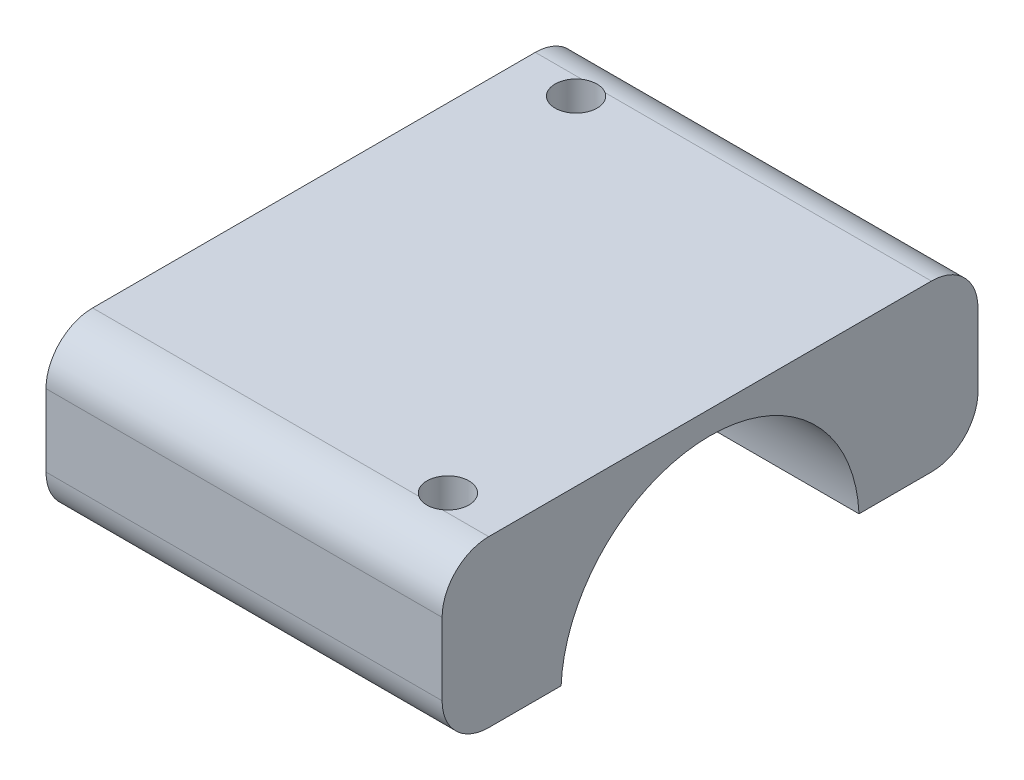
ISO-10303-21;
HEADER;
FILE_DESCRIPTION(('STEP AP214'),'2;1');
FILE_NAME('part.step','',(''),(''),'','','');
FILE_SCHEMA(('AUTOMOTIVE_DESIGN { 1 0 10303 214 1 1 1 1 }'));
ENDSEC;
DATA;
#1=APPLICATION_CONTEXT('core data for automotive mechanical design processes');
#2=APPLICATION_PROTOCOL_DEFINITION('international standard','automotive_design',2000,#1);
#3=PRODUCT_CONTEXT('',#1,'mechanical');
#4=PRODUCT('Part','Part','',(#3));
#5=PRODUCT_RELATED_PRODUCT_CATEGORY('part','',(#4));
#6=PRODUCT_DEFINITION_FORMATION('','',#4);
#7=PRODUCT_DEFINITION_CONTEXT('part definition',#1,'design');
#8=PRODUCT_DEFINITION('design','',#6,#7);
#9=PRODUCT_DEFINITION_SHAPE('','',#8);
#10=(LENGTH_UNIT() NAMED_UNIT(*) SI_UNIT(.MILLI.,.METRE.));
#11=(NAMED_UNIT(*) PLANE_ANGLE_UNIT() SI_UNIT($,.RADIAN.));
#12=(NAMED_UNIT(*) SI_UNIT($,.STERADIAN.) SOLID_ANGLE_UNIT());
#13=UNCERTAINTY_MEASURE_WITH_UNIT(LENGTH_MEASURE(1.E-05),#10,'distance_accuracy_value','');
#14=(GEOMETRIC_REPRESENTATION_CONTEXT(3) GLOBAL_UNCERTAINTY_ASSIGNED_CONTEXT((#13)) GLOBAL_UNIT_ASSIGNED_CONTEXT((#10,
#11,#12)) REPRESENTATION_CONTEXT('',''));
#15=CARTESIAN_POINT('',(0.,0.,0.));
#16=DIRECTION('',(0.,0.,1.));
#17=DIRECTION('',(1.,0.,0.));
#18=AXIS2_PLACEMENT_3D('',#15,#16,#17);
#19=CARTESIAN_POINT('',(17.,4.6,19.));
#20=DIRECTION('',(-1.,0.,0.));
#21=DIRECTION('',(0.,0.,1.));
#22=AXIS2_PLACEMENT_3D('',#19,#20,#21);
#23=CYLINDRICAL_SURFACE('',#22,4.);
#24=CARTESIAN_POINT('',(12.9949874371066,0.6,19.));
#25=CARTESIAN_POINT('',(12.9528080505859,0.600002290201008,19.0279782687762));
#26=CARTESIAN_POINT('',(12.9094699375662,0.600293109258532,19.054162436945));
#27=CARTESIAN_POINT('',(12.8207506643026,0.601246630542694,19.1027880961604));
#28=CARTESIAN_POINT('',(12.775369663094,0.601909303866988,19.1252298779078));
#29=CARTESIAN_POINT('',(12.6367080465194,0.60414515604213,19.1866521635867));
#30=CARTESIAN_POINT('',(12.5407755741953,0.605967454515857,19.2198177956695));
#31=CARTESIAN_POINT('',(12.3447108790185,0.609016111648687,19.2695824039112));
#32=CARTESIAN_POINT('',(12.2445771529861,0.610242254997947,19.2861753969049));
#33=CARTESIAN_POINT('',(12.0429252939834,0.611432977587128,19.3023260095373));
#34=CARTESIAN_POINT('',(11.9414072407699,0.611397629202322,19.3018846064864));
#35=CARTESIAN_POINT('',(11.7400149572337,0.6100843959537,19.2839916011113));
#36=CARTESIAN_POINT('',(11.6401391343925,0.608807797075412,19.266557603754));
#37=CARTESIAN_POINT('',(11.444762981889,0.605710678825216,19.2151942389305));
#38=CARTESIAN_POINT('',(11.3492591599958,0.603890602630139,19.181278297527));
#39=CARTESIAN_POINT('',(11.2134628948282,0.601745422922836,19.1197807652606));
#40=CARTESIAN_POINT('',(11.1703945654969,0.601136078493984,19.0981480345368));
#41=CARTESIAN_POINT('',(11.0862091669758,0.600264553601652,19.0515455180329));
#42=CARTESIAN_POINT('',(11.0450884560688,0.600001698383489,19.0265823227808));
#43=CARTESIAN_POINT('',(11.0050125628934,0.6,19.));
#44=B_SPLINE_CURVE_WITH_KNOTS('',3,(#24,#25,#26,#27,#28,#29,#30,#31,#32,#33,#34,#35,#36,#37,#38,
#39,#40,#41,#42,#43),.UNSPECIFIED.,.F.,.F.,(4,2,2,2,2,2,2,2,2,4),(0.,0.151748564164442,
0.30348533531734,0.606485618853393,0.90959525408197,1.21268749909945,1.51546606256915,
1.81799839737315,1.96246492195647,2.10664969408635),.UNSPECIFIED.);
#45=CARTESIAN_POINT('',(12.9949874371066,0.6,19.));
#46=VERTEX_POINT('',#45);
#47=CARTESIAN_POINT('',(11.0050125628934,0.6,19.));
#48=VERTEX_POINT('',#47);
#49=EDGE_CURVE('E136',#46,#48,#44,.T.);
#50=ORIENTED_EDGE('',*,*,#49,.F.);
#51=DIRECTION('',(-1.,0.,0.));
#52=VECTOR('',#51,1.);
#53=CARTESIAN_POINT('',(17.,0.6,19.));
#54=LINE('',#53,#52);
#55=CARTESIAN_POINT('',(17.,0.6,19.));
#56=VERTEX_POINT('',#55);
#57=EDGE_CURVE('E150',#56,#46,#54,.T.);
#58=ORIENTED_EDGE('',*,*,#57,.F.);
#59=CARTESIAN_POINT('',(17.,4.6,19.));
#60=DIRECTION('',(1.,0.,0.));
#61=DIRECTION('',(0.,0.,-1.));
#62=AXIS2_PLACEMENT_3D('',#59,#60,#61);
#63=CIRCLE('',#62,4.);
#64=CARTESIAN_POINT('',(17.,4.6,23.));
#65=VERTEX_POINT('',#64);
#66=EDGE_CURVE('E333',#65,#56,#63,.T.);
#67=ORIENTED_EDGE('',*,*,#66,.F.);
#68=DIRECTION('',(-1.,0.,0.));
#69=VECTOR('',#68,1.);
#70=CARTESIAN_POINT('',(17.,4.6,23.));
#71=LINE('',#70,#69);
#72=CARTESIAN_POINT('',(-17.,4.6,23.));
#73=VERTEX_POINT('',#72);
#74=EDGE_CURVE('E313',#65,#73,#71,.T.);
#75=ORIENTED_EDGE('',*,*,#74,.T.);
#76=CARTESIAN_POINT('',(-17.,4.6,19.));
#77=DIRECTION('',(1.,0.,0.));
#78=DIRECTION('',(0.,0.,-1.));
#79=AXIS2_PLACEMENT_3D('',#76,#77,#78);
#80=CIRCLE('',#79,4.);
#81=CARTESIAN_POINT('',(-17.,0.6,19.));
#82=VERTEX_POINT('',#81);
#83=EDGE_CURVE('E155',#73,#82,#80,.T.);
#84=ORIENTED_EDGE('',*,*,#83,.T.);
#85=EDGE_CURVE('E148',#48,#82,#54,.T.);
#86=ORIENTED_EDGE('',*,*,#85,.F.);
#87=EDGE_LOOP('',(#50,#58,#67,#75,#84,#86));
#88=FACE_BOUND('',#87,.T.);
#89=ADVANCED_FACE('F39',(#88),#23,.T.);
#90=CARTESIAN_POINT('',(17.,4.6,-19.));
#91=DIRECTION('',(-1.,0.,0.));
#92=DIRECTION('',(0.,0.,1.));
#93=AXIS2_PLACEMENT_3D('',#90,#91,#92);
#94=CYLINDRICAL_SURFACE('',#93,4.);
#95=CARTESIAN_POINT('',(-12.9949874371066,0.6,-19.));
#96=CARTESIAN_POINT('',(-12.9528080505859,0.600002290201008,-19.0279782687762));
#97=CARTESIAN_POINT('',(-12.9094699375662,0.600293109258532,-19.054162436945));
#98=CARTESIAN_POINT('',(-12.8207506643026,0.601246630542694,-19.1027880961604));
#99=CARTESIAN_POINT('',(-12.775369663094,0.601909303866988,-19.1252298779078));
#100=CARTESIAN_POINT('',(-12.6367080465194,0.60414515604213,-19.1866521635867));
#101=CARTESIAN_POINT('',(-12.5407755741953,0.605967454515857,-19.2198177956695));
#102=CARTESIAN_POINT('',(-12.3447108790185,0.609016111648687,-19.2695824039112));
#103=CARTESIAN_POINT('',(-12.2445771529861,0.610242254997947,-19.2861753969049));
#104=CARTESIAN_POINT('',(-12.0429252939834,0.611432977587128,-19.3023260095373));
#105=CARTESIAN_POINT('',(-11.9414072407699,0.611397629202322,-19.3018846064864));
#106=CARTESIAN_POINT('',(-11.7400149572337,0.6100843959537,-19.2839916011113));
#107=CARTESIAN_POINT('',(-11.6401391343925,0.608807797075412,-19.266557603754));
#108=CARTESIAN_POINT('',(-11.444762981889,0.605710678825216,-19.2151942389305));
#109=CARTESIAN_POINT('',(-11.3492591599958,0.603890602630139,-19.181278297527));
#110=CARTESIAN_POINT('',(-11.2134628948282,0.601745422922836,-19.1197807652606));
#111=CARTESIAN_POINT('',(-11.1703945654969,0.601136078493984,-19.0981480345368));
#112=CARTESIAN_POINT('',(-11.0862091669758,0.600264553601652,-19.0515455180329));
#113=CARTESIAN_POINT('',(-11.0450884560688,0.600001698383489,-19.0265823227808));
#114=CARTESIAN_POINT('',(-11.0050125628934,0.6,-19.));
#115=B_SPLINE_CURVE_WITH_KNOTS('',3,(#95,#96,#97,#98,#99,#100,#101,#102,#103,#104,#105,#106,
#107,#108,#109,#110,#111,#112,#113,#114),.UNSPECIFIED.,.F.,.F.,(4,2,2,2,2,2,2,2,2,4),(0.,
0.151748564164442,0.30348533531734,0.606485618853393,0.90959525408197,1.21268749909945,
1.51546606256915,1.81799839737315,1.96246492195647,2.10664969408635),.UNSPECIFIED.);
#116=CARTESIAN_POINT('',(-12.9949874371066,0.6,-19.));
#117=VERTEX_POINT('',#116);
#118=CARTESIAN_POINT('',(-11.0050125628934,0.6,-19.));
#119=VERTEX_POINT('',#118);
#120=EDGE_CURVE('E194',#117,#119,#115,.T.);
#121=ORIENTED_EDGE('',*,*,#120,.F.);
#122=DIRECTION('',(-1.,0.,0.));
#123=VECTOR('',#122,1.);
#124=CARTESIAN_POINT('',(17.,0.6,-19.));
#125=LINE('',#124,#123);
#126=CARTESIAN_POINT('',(-17.,0.6,-19.));
#127=VERTEX_POINT('',#126);
#128=EDGE_CURVE('E159',#117,#127,#125,.T.);
#129=ORIENTED_EDGE('',*,*,#128,.T.);
#130=CARTESIAN_POINT('',(-17.,4.6,-19.));
#131=DIRECTION('',(1.,0.,0.));
#132=DIRECTION('',(0.,0.,-1.));
#133=AXIS2_PLACEMENT_3D('',#130,#131,#132);
#134=CIRCLE('',#133,4.);
#135=CARTESIAN_POINT('',(-17.,4.6,-23.));
#136=VERTEX_POINT('',#135);
#137=EDGE_CURVE('E319',#127,#136,#134,.T.);
#138=ORIENTED_EDGE('',*,*,#137,.T.);
#139=DIRECTION('',(-1.,0.,0.));
#140=VECTOR('',#139,1.);
#141=CARTESIAN_POINT('',(17.,4.6,-23.));
#142=LINE('',#141,#140);
#143=CARTESIAN_POINT('',(17.,4.6,-23.));
#144=VERTEX_POINT('',#143);
#145=EDGE_CURVE('E293',#144,#136,#142,.T.);
#146=ORIENTED_EDGE('',*,*,#145,.F.);
#147=CARTESIAN_POINT('',(17.,4.6,-19.));
#148=DIRECTION('',(1.,0.,0.));
#149=DIRECTION('',(0.,0.,-1.));
#150=AXIS2_PLACEMENT_3D('',#147,#148,#149);
#151=CIRCLE('',#150,4.);
#152=CARTESIAN_POINT('',(17.,0.6,-19.));
#153=VERTEX_POINT('',#152);
#154=EDGE_CURVE('E291',#153,#144,#151,.T.);
#155=ORIENTED_EDGE('',*,*,#154,.F.);
#156=EDGE_CURVE('E156',#153,#119,#125,.T.);
#157=ORIENTED_EDGE('',*,*,#156,.T.);
#158=EDGE_LOOP('',(#121,#129,#138,#146,#155,#157));
#159=FACE_BOUND('',#158,.T.);
#160=ADVANCED_FACE('F205',(#159),#94,.T.);
#161=CARTESIAN_POINT('',(17.,10.8,-19.));
#162=DIRECTION('',(-1.,0.,0.));
#163=DIRECTION('',(0.,0.,1.));
#164=AXIS2_PLACEMENT_3D('',#161,#162,#163);
#165=CYLINDRICAL_SURFACE('',#164,4.);
#166=CARTESIAN_POINT('',(-11.0050125628934,14.8,-19.));
#167=CARTESIAN_POINT('',(-11.0471919494141,14.799997709799,-19.0279782687762));
#168=CARTESIAN_POINT('',(-11.0905300624338,14.7997068907415,-19.054162436945));
#169=CARTESIAN_POINT('',(-11.1792493356974,14.7987533694573,-19.1027880961604));
#170=CARTESIAN_POINT('',(-11.224630336906,14.798090696133,-19.1252298779078));
#171=CARTESIAN_POINT('',(-11.3632919534806,14.7958548439579,-19.1866521635867));
#172=CARTESIAN_POINT('',(-11.4592244258047,14.7940325454841,-19.2198177956695));
#173=CARTESIAN_POINT('',(-11.6552891209815,14.7909838883513,-19.2695824039112));
#174=CARTESIAN_POINT('',(-11.7554228470139,14.7897577450021,-19.2861753969049));
#175=CARTESIAN_POINT('',(-11.9570747060166,14.7885670224129,-19.3023260095373));
#176=CARTESIAN_POINT('',(-12.0585927592301,14.7886023707977,-19.3018846064864));
#177=CARTESIAN_POINT('',(-12.2599850427663,14.7899156040463,-19.2839916011113));
#178=CARTESIAN_POINT('',(-12.3598608656075,14.7911922029246,-19.266557603754));
#179=CARTESIAN_POINT('',(-12.555237018111,14.7942893211748,-19.2151942389305));
#180=CARTESIAN_POINT('',(-12.6507408400042,14.7961093973699,-19.181278297527));
#181=CARTESIAN_POINT('',(-12.7865371051718,14.7982545770772,-19.1197807652606));
#182=CARTESIAN_POINT('',(-12.8296054345031,14.798863921506,-19.0981480345368));
#183=CARTESIAN_POINT('',(-12.9137908330242,14.7997354463983,-19.0515455180329));
#184=CARTESIAN_POINT('',(-12.9549115439312,14.7999983016165,-19.0265823227808));
#185=CARTESIAN_POINT('',(-12.9949874371066,14.8,-19.));
#186=B_SPLINE_CURVE_WITH_KNOTS('',3,(#166,#167,#168,#169,#170,#171,#172,#173,#174,#175,#176,
#177,#178,#179,#180,#181,#182,#183,#184,#185),.UNSPECIFIED.,.F.,.F.,(4,2,2,2,2,2,2,2,2,4),(0.,
0.151748564164442,0.30348533531734,0.606485618853393,0.909595254081972,1.21268749909945,
1.51546606256915,1.81799839737315,1.96246492195647,2.10664969408635),.UNSPECIFIED.);
#187=CARTESIAN_POINT('',(-11.0050125628934,14.8,-19.));
#188=VERTEX_POINT('',#187);
#189=CARTESIAN_POINT('',(-12.9949874371066,14.8,-19.));
#190=VERTEX_POINT('',#189);
#191=EDGE_CURVE('E142',#188,#190,#186,.T.);
#192=ORIENTED_EDGE('',*,*,#191,.F.);
#193=DIRECTION('',(-1.,0.,0.));
#194=VECTOR('',#193,1.);
#195=CARTESIAN_POINT('',(17.,14.8,-19.));
#196=LINE('',#195,#194);
#197=CARTESIAN_POINT('',(17.,14.8,-19.));
#198=VERTEX_POINT('',#197);
#199=EDGE_CURVE('E343',#198,#188,#196,.T.);
#200=ORIENTED_EDGE('',*,*,#199,.F.);
#201=CARTESIAN_POINT('',(17.,10.8,-19.));
#202=DIRECTION('',(1.,0.,0.));
#203=DIRECTION('',(0.,0.,-1.));
#204=AXIS2_PLACEMENT_3D('',#201,#202,#203);
#205=CIRCLE('',#204,4.);
#206=CARTESIAN_POINT('',(17.,10.8,-23.));
#207=VERTEX_POINT('',#206);
#208=EDGE_CURVE('E299',#207,#198,#205,.T.);
#209=ORIENTED_EDGE('',*,*,#208,.F.);
#210=DIRECTION('',(-1.,0.,0.));
#211=VECTOR('',#210,1.);
#212=CARTESIAN_POINT('',(17.,10.8,-23.));
#213=LINE('',#212,#211);
#214=CARTESIAN_POINT('',(-17.,10.8,-23.));
#215=VERTEX_POINT('',#214);
#216=EDGE_CURVE('E346',#207,#215,#213,.T.);
#217=ORIENTED_EDGE('',*,*,#216,.T.);
#218=CARTESIAN_POINT('',(-17.,10.8,-19.));
#219=DIRECTION('',(1.,0.,0.));
#220=DIRECTION('',(0.,0.,-1.));
#221=AXIS2_PLACEMENT_3D('',#218,#219,#220);
#222=CIRCLE('',#221,4.);
#223=CARTESIAN_POINT('',(-17.,14.8,-19.));
#224=VERTEX_POINT('',#223);
#225=EDGE_CURVE('E323',#215,#224,#222,.T.);
#226=ORIENTED_EDGE('',*,*,#225,.T.);
#227=EDGE_CURVE('E342',#190,#224,#196,.T.);
#228=ORIENTED_EDGE('',*,*,#227,.F.);
#229=EDGE_LOOP('',(#192,#200,#209,#217,#226,#228));
#230=FACE_BOUND('',#229,.T.);
#231=ADVANCED_FACE('F201',(#230),#165,.T.);
#232=CARTESIAN_POINT('',(17.,10.8,19.));
#233=DIRECTION('',(-1.,0.,0.));
#234=DIRECTION('',(0.,0.,1.));
#235=AXIS2_PLACEMENT_3D('',#232,#233,#234);
#236=CYLINDRICAL_SURFACE('',#235,4.);
#237=CARTESIAN_POINT('',(11.0050125628934,14.8,19.));
#238=CARTESIAN_POINT('',(11.0471919494141,14.799997709799,19.0279782687762));
#239=CARTESIAN_POINT('',(11.0905300624338,14.7997068907415,19.054162436945));
#240=CARTESIAN_POINT('',(11.1792493356974,14.7987533694573,19.1027880961604));
#241=CARTESIAN_POINT('',(11.224630336906,14.798090696133,19.1252298779078));
#242=CARTESIAN_POINT('',(11.3632919534806,14.7958548439579,19.1866521635867));
#243=CARTESIAN_POINT('',(11.4592244258047,14.7940325454841,19.2198177956695));
#244=CARTESIAN_POINT('',(11.6552891209815,14.7909838883513,19.2695824039112));
#245=CARTESIAN_POINT('',(11.7554228470139,14.7897577450021,19.2861753969049));
#246=CARTESIAN_POINT('',(11.9570747060166,14.7885670224129,19.3023260095373));
#247=CARTESIAN_POINT('',(12.0585927592301,14.7886023707977,19.3018846064864));
#248=CARTESIAN_POINT('',(12.2599850427663,14.7899156040463,19.2839916011113));
#249=CARTESIAN_POINT('',(12.3598608656075,14.7911922029246,19.266557603754));
#250=CARTESIAN_POINT('',(12.555237018111,14.7942893211748,19.2151942389305));
#251=CARTESIAN_POINT('',(12.6507408400042,14.7961093973699,19.181278297527));
#252=CARTESIAN_POINT('',(12.7865371051718,14.7982545770772,19.1197807652606));
#253=CARTESIAN_POINT('',(12.8296054345031,14.798863921506,19.0981480345368));
#254=CARTESIAN_POINT('',(12.9137908330242,14.7997354463983,19.0515455180329));
#255=CARTESIAN_POINT('',(12.9549115439312,14.7999983016165,19.0265823227808));
#256=CARTESIAN_POINT('',(12.9949874371066,14.8,19.));
#257=B_SPLINE_CURVE_WITH_KNOTS('',3,(#237,#238,#239,#240,#241,#242,#243,#244,#245,#246,#247,
#248,#249,#250,#251,#252,#253,#254,#255,#256),.UNSPECIFIED.,.F.,.F.,(4,2,2,2,2,2,2,2,2,4),(0.,
0.151748564164442,0.30348533531734,0.606485618853393,0.909595254081972,1.21268749909945,
1.51546606256915,1.81799839737315,1.96246492195647,2.10664969408635),.UNSPECIFIED.);
#258=CARTESIAN_POINT('',(11.0050125628934,14.8,19.));
#259=VERTEX_POINT('',#258);
#260=CARTESIAN_POINT('',(12.9949874371066,14.8,19.));
#261=VERTEX_POINT('',#260);
#262=EDGE_CURVE('E47',#259,#261,#257,.T.);
#263=ORIENTED_EDGE('',*,*,#262,.F.);
#264=DIRECTION('',(-1.,0.,0.));
#265=VECTOR('',#264,1.);
#266=CARTESIAN_POINT('',(17.,14.8,19.));
#267=LINE('',#266,#265);
#268=CARTESIAN_POINT('',(-17.,14.8,19.));
#269=VERTEX_POINT('',#268);
#270=EDGE_CURVE('E338',#259,#269,#267,.T.);
#271=ORIENTED_EDGE('',*,*,#270,.T.);
#272=CARTESIAN_POINT('',(-17.,10.8,19.));
#273=DIRECTION('',(1.,0.,0.));
#274=DIRECTION('',(0.,0.,-1.));
#275=AXIS2_PLACEMENT_3D('',#272,#273,#274);
#276=CIRCLE('',#275,4.);
#277=CARTESIAN_POINT('',(-17.,10.8,23.));
#278=VERTEX_POINT('',#277);
#279=EDGE_CURVE('E329',#269,#278,#276,.T.);
#280=ORIENTED_EDGE('',*,*,#279,.T.);
#281=DIRECTION('',(-1.,0.,0.));
#282=VECTOR('',#281,1.);
#283=CARTESIAN_POINT('',(17.,10.8,23.));
#284=LINE('',#283,#282);
#285=CARTESIAN_POINT('',(17.,10.8,23.));
#286=VERTEX_POINT('',#285);
#287=EDGE_CURVE('E335',#286,#278,#284,.T.);
#288=ORIENTED_EDGE('',*,*,#287,.F.);
#289=CARTESIAN_POINT('',(17.,10.8,19.));
#290=DIRECTION('',(1.,0.,0.));
#291=DIRECTION('',(0.,0.,-1.));
#292=AXIS2_PLACEMENT_3D('',#289,#290,#291);
#293=CIRCLE('',#292,4.);
#294=CARTESIAN_POINT('',(17.,14.8,19.));
#295=VERTEX_POINT('',#294);
#296=EDGE_CURVE('E309',#295,#286,#293,.T.);
#297=ORIENTED_EDGE('',*,*,#296,.F.);
#298=EDGE_CURVE('E339',#295,#261,#267,.T.);
#299=ORIENTED_EDGE('',*,*,#298,.T.);
#300=EDGE_LOOP('',(#263,#271,#280,#288,#297,#299));
#301=FACE_BOUND('',#300,.T.);
#302=ADVANCED_FACE('F168',(#301),#236,.T.);
#303=CARTESIAN_POINT('',(17.,0.6,19.));
#304=DIRECTION('',(0.,1.,0.));
#305=DIRECTION('',(0.,0.,1.));
#306=AXIS2_PLACEMENT_3D('',#303,#304,#305);
#307=PLANE('',#306);
#308=CARTESIAN_POINT('',(12.,0.6,17.5));
#309=DIRECTION('',(0.,1.,0.));
#310=DIRECTION('',(0.,0.,1.));
#311=AXIS2_PLACEMENT_3D('',#308,#309,#310);
#312=CIRCLE('',#311,1.8);
#313=EDGE_CURVE('E53',#46,#48,#312,.T.);
#314=ORIENTED_EDGE('',*,*,#313,.T.);
#315=ORIENTED_EDGE('',*,*,#85,.T.);
#316=DIRECTION('',(0.,0.,-1.));
#317=VECTOR('',#316,1.);
#318=CARTESIAN_POINT('',(-17.,0.6,19.));
#319=LINE('',#318,#317);
#320=CARTESIAN_POINT('',(-17.,0.6,12.7859297667397));
#321=VERTEX_POINT('',#320);
#322=EDGE_CURVE('E317',#82,#321,#319,.T.);
#323=ORIENTED_EDGE('',*,*,#322,.T.);
#324=DIRECTION('',(1.,0.,0.));
#325=VECTOR('',#324,1.);
#326=CARTESIAN_POINT('',(-17.,0.6,12.7859297667397));
#327=LINE('',#326,#325);
#328=CARTESIAN_POINT('',(17.,0.6,12.7859297667397));
#329=VERTEX_POINT('',#328);
#330=EDGE_CURVE('E316',#321,#329,#327,.T.);
#331=ORIENTED_EDGE('',*,*,#330,.T.);
#332=DIRECTION('',(0.,0.,-1.));
#333=VECTOR('',#332,1.);
#334=CARTESIAN_POINT('',(17.,0.6,19.));
#335=LINE('',#334,#333);
#336=EDGE_CURVE('E297',#56,#329,#335,.T.);
#337=ORIENTED_EDGE('',*,*,#336,.F.);
#338=ORIENTED_EDGE('',*,*,#57,.T.);
#339=EDGE_LOOP('',(#314,#315,#323,#331,#337,#338));
#340=FACE_BOUND('',#339,.T.);
#341=ADVANCED_FACE('F146',(#340),#307,.F.);
#342=CARTESIAN_POINT('',(-12.,0.6,-17.5));
#343=DIRECTION('',(0.,1.,0.));
#344=DIRECTION('',(0.,0.,1.));
#345=AXIS2_PLACEMENT_3D('',#342,#343,#344);
#346=CIRCLE('',#345,1.8);
#347=EDGE_CURVE('E60',#117,#119,#346,.T.);
#348=ORIENTED_EDGE('',*,*,#347,.T.);
#349=ORIENTED_EDGE('',*,*,#156,.F.);
#350=CARTESIAN_POINT('',(17.,0.6,-12.7859297667397));
#351=VERTEX_POINT('',#350);
#352=EDGE_CURVE('E302',#351,#153,#335,.T.);
#353=ORIENTED_EDGE('',*,*,#352,.F.);
#354=DIRECTION('',(1.,0.,0.));
#355=VECTOR('',#354,1.);
#356=CARTESIAN_POINT('',(-17.,0.6,-12.7859297667397));
#357=LINE('',#356,#355);
#358=CARTESIAN_POINT('',(-17.,0.6,-12.7859297667397));
#359=VERTEX_POINT('',#358);
#360=EDGE_CURVE('E352',#351,#359,#357,.F.);
#361=ORIENTED_EDGE('',*,*,#360,.T.);
#362=EDGE_CURVE('E315',#359,#127,#319,.T.);
#363=ORIENTED_EDGE('',*,*,#362,.T.);
#364=ORIENTED_EDGE('',*,*,#128,.F.);
#365=EDGE_LOOP('',(#348,#349,#353,#361,#363,#364));
#366=FACE_BOUND('',#365,.T.);
#367=ADVANCED_FACE('F210',(#366),#307,.F.);
#368=CARTESIAN_POINT('',(17.,4.6,-23.));
#369=DIRECTION('',(0.,0.,1.));
#370=DIRECTION('',(1.,0.,0.));
#371=AXIS2_PLACEMENT_3D('',#368,#369,#370);
#372=PLANE('',#371);
#373=DIRECTION('',(0.,1.,0.));
#374=VECTOR('',#373,1.);
#375=CARTESIAN_POINT('',(-17.,4.6,-23.));
#376=LINE('',#375,#374);
#377=EDGE_CURVE('E321',#136,#215,#376,.T.);
#378=ORIENTED_EDGE('',*,*,#377,.T.);
#379=ORIENTED_EDGE('',*,*,#216,.F.);
#380=DIRECTION('',(0.,1.,0.));
#381=VECTOR('',#380,1.);
#382=CARTESIAN_POINT('',(17.,4.6,-23.));
#383=LINE('',#382,#381);
#384=EDGE_CURVE('E296',#144,#207,#383,.T.);
#385=ORIENTED_EDGE('',*,*,#384,.F.);
#386=ORIENTED_EDGE('',*,*,#145,.T.);
#387=EDGE_LOOP('',(#378,#379,#385,#386));
#388=FACE_BOUND('',#387,.T.);
#389=ADVANCED_FACE('F208',(#388),#372,.F.);
#390=CARTESIAN_POINT('',(17.,14.8,-19.));
#391=DIRECTION('',(0.,-1.,0.));
#392=DIRECTION('',(0.,0.,-1.));
#393=AXIS2_PLACEMENT_3D('',#390,#391,#392);
#394=PLANE('',#393);
#395=CARTESIAN_POINT('',(12.,14.8,17.5));
#396=DIRECTION('',(0.,-1.,0.));
#397=DIRECTION('',(0.,0.,-1.));
#398=AXIS2_PLACEMENT_3D('',#395,#396,#397);
#399=CIRCLE('',#398,1.8);
#400=EDGE_CURVE('E143',#261,#259,#399,.F.);
#401=ORIENTED_EDGE('',*,*,#400,.F.);
#402=ORIENTED_EDGE('',*,*,#298,.F.);
#403=DIRECTION('',(0.,0.,1.));
#404=VECTOR('',#403,1.);
#405=CARTESIAN_POINT('',(17.,14.8,-19.));
#406=LINE('',#405,#404);
#407=EDGE_CURVE('E307',#198,#295,#406,.T.);
#408=ORIENTED_EDGE('',*,*,#407,.F.);
#409=ORIENTED_EDGE('',*,*,#199,.T.);
#410=CARTESIAN_POINT('',(-12.,14.8,-17.5));
#411=DIRECTION('',(0.,-1.,0.));
#412=DIRECTION('',(0.,0.,-1.));
#413=AXIS2_PLACEMENT_3D('',#410,#411,#412);
#414=CIRCLE('',#413,1.8);
#415=EDGE_CURVE('E11',#190,#188,#414,.F.);
#416=ORIENTED_EDGE('',*,*,#415,.F.);
#417=ORIENTED_EDGE('',*,*,#227,.T.);
#418=DIRECTION('',(0.,0.,1.));
#419=VECTOR('',#418,1.);
#420=CARTESIAN_POINT('',(-17.,14.8,-19.));
#421=LINE('',#420,#419);
#422=EDGE_CURVE('E326',#224,#269,#421,.T.);
#423=ORIENTED_EDGE('',*,*,#422,.T.);
#424=ORIENTED_EDGE('',*,*,#270,.F.);
#425=EDGE_LOOP('',(#401,#402,#408,#409,#416,#417,#423,#424));
#426=FACE_BOUND('',#425,.T.);
#427=ADVANCED_FACE('F207',(#426),#394,.F.);
#428=CARTESIAN_POINT('',(17.,10.8,23.));
#429=DIRECTION('',(0.,0.,-1.));
#430=DIRECTION('',(-1.,0.,0.));
#431=AXIS2_PLACEMENT_3D('',#428,#429,#430);
#432=PLANE('',#431);
#433=DIRECTION('',(0.,-1.,0.));
#434=VECTOR('',#433,1.);
#435=CARTESIAN_POINT('',(-17.,10.8,23.));
#436=LINE('',#435,#434);
#437=EDGE_CURVE('E331',#278,#73,#436,.T.);
#438=ORIENTED_EDGE('',*,*,#437,.T.);
#439=ORIENTED_EDGE('',*,*,#74,.F.);
#440=DIRECTION('',(0.,-1.,0.));
#441=VECTOR('',#440,1.);
#442=CARTESIAN_POINT('',(17.,10.8,23.));
#443=LINE('',#442,#441);
#444=EDGE_CURVE('E311',#286,#65,#443,.T.);
#445=ORIENTED_EDGE('',*,*,#444,.F.);
#446=ORIENTED_EDGE('',*,*,#287,.T.);
#447=EDGE_LOOP('',(#438,#439,#445,#446));
#448=FACE_BOUND('',#447,.T.);
#449=ADVANCED_FACE('F376',(#448),#432,.F.);
#450=CARTESIAN_POINT('',(17.,4.6,19.));
#451=DIRECTION('',(1.,0.,0.));
#452=DIRECTION('',(0.,0.,-1.));
#453=AXIS2_PLACEMENT_3D('',#450,#451,#452);
#454=PLANE('',#453);
#455=CARTESIAN_POINT('',(17.,0.,0.));
#456=DIRECTION('',(1.,0.,0.));
#457=DIRECTION('',(0.,0.,-1.));
#458=AXIS2_PLACEMENT_3D('',#455,#456,#457);
#459=CIRCLE('',#458,12.8);
#460=EDGE_CURVE('E285',#351,#329,#459,.T.);
#461=ORIENTED_EDGE('',*,*,#460,.F.);
#462=ORIENTED_EDGE('',*,*,#352,.T.);
#463=ORIENTED_EDGE('',*,*,#154,.T.);
#464=ORIENTED_EDGE('',*,*,#384,.T.);
#465=ORIENTED_EDGE('',*,*,#208,.T.);
#466=ORIENTED_EDGE('',*,*,#407,.T.);
#467=ORIENTED_EDGE('',*,*,#296,.T.);
#468=ORIENTED_EDGE('',*,*,#444,.T.);
#469=ORIENTED_EDGE('',*,*,#66,.T.);
#470=ORIENTED_EDGE('',*,*,#336,.T.);
#471=EDGE_LOOP('',(#461,#462,#463,#464,#465,#466,#467,#468,#469,#470));
#472=FACE_BOUND('',#471,.T.);
#473=ADVANCED_FACE('F363',(#472),#454,.T.);
#474=CARTESIAN_POINT('',(-17.,4.6,19.));
#475=DIRECTION('',(1.,0.,0.));
#476=DIRECTION('',(0.,0.,-1.));
#477=AXIS2_PLACEMENT_3D('',#474,#475,#476);
#478=PLANE('',#477);
#479=ORIENTED_EDGE('',*,*,#362,.F.);
#480=CARTESIAN_POINT('',(-17.,0.,0.));
#481=DIRECTION('',(1.,0.,0.));
#482=DIRECTION('',(0.,0.,-1.));
#483=AXIS2_PLACEMENT_3D('',#480,#481,#482);
#484=CIRCLE('',#483,12.8);
#485=EDGE_CURVE('E383',#359,#321,#484,.T.);
#486=ORIENTED_EDGE('',*,*,#485,.T.);
#487=ORIENTED_EDGE('',*,*,#322,.F.);
#488=ORIENTED_EDGE('',*,*,#83,.F.);
#489=ORIENTED_EDGE('',*,*,#437,.F.);
#490=ORIENTED_EDGE('',*,*,#279,.F.);
#491=ORIENTED_EDGE('',*,*,#422,.F.);
#492=ORIENTED_EDGE('',*,*,#225,.F.);
#493=ORIENTED_EDGE('',*,*,#377,.F.);
#494=ORIENTED_EDGE('',*,*,#137,.F.);
#495=EDGE_LOOP('',(#479,#486,#487,#488,#489,#490,#491,#492,#493,#494));
#496=FACE_BOUND('',#495,.T.);
#497=ADVANCED_FACE('F254',(#496),#478,.F.);
#498=CARTESIAN_POINT('',(-17.,0.,0.));
#499=DIRECTION('',(1.,0.,0.));
#500=DIRECTION('',(0.,0.,-1.));
#501=AXIS2_PLACEMENT_3D('',#498,#499,#500);
#502=CYLINDRICAL_SURFACE('',#501,12.8);
#503=ORIENTED_EDGE('',*,*,#485,.F.);
#504=ORIENTED_EDGE('',*,*,#360,.F.);
#505=ORIENTED_EDGE('',*,*,#460,.T.);
#506=ORIENTED_EDGE('',*,*,#330,.F.);
#507=EDGE_LOOP('',(#503,#504,#505,#506));
#508=FACE_BOUND('',#507,.T.);
#509=ADVANCED_FACE('F176',(#508),#502,.F.);
#510=CARTESIAN_POINT('',(12.,15.4,17.5));
#511=DIRECTION('',(0.,-1.,0.));
#512=DIRECTION('',(0.,0.,-1.));
#513=AXIS2_PLACEMENT_3D('',#510,#511,#512);
#514=CYLINDRICAL_SURFACE('',#513,1.8);
#515=ORIENTED_EDGE('',*,*,#400,.T.);
#516=ORIENTED_EDGE('',*,*,#262,.T.);
#517=EDGE_LOOP('',(#515,#516));
#518=FACE_BOUND('',#517,.T.);
#519=ORIENTED_EDGE('',*,*,#49,.T.);
#520=ORIENTED_EDGE('',*,*,#313,.F.);
#521=EDGE_LOOP('',(#519,#520));
#522=FACE_BOUND('',#521,.T.);
#523=ADVANCED_FACE('F137',(#518,#522),#514,.F.);
#524=CARTESIAN_POINT('',(-12.,15.4,-17.5));
#525=DIRECTION('',(0.,-1.,0.));
#526=DIRECTION('',(0.,0.,-1.));
#527=AXIS2_PLACEMENT_3D('',#524,#525,#526);
#528=CYLINDRICAL_SURFACE('',#527,1.8);
#529=ORIENTED_EDGE('',*,*,#191,.T.);
#530=ORIENTED_EDGE('',*,*,#415,.T.);
#531=EDGE_LOOP('',(#529,#530));
#532=FACE_BOUND('',#531,.T.);
#533=ORIENTED_EDGE('',*,*,#120,.T.);
#534=ORIENTED_EDGE('',*,*,#347,.F.);
#535=EDGE_LOOP('',(#533,#534));
#536=FACE_BOUND('',#535,.T.);
#537=ADVANCED_FACE('F175',(#532,#536),#528,.F.);
#538=CLOSED_SHELL('',(#89,#160,#231,#302,#341,#367,#389,#427,#449,#473,#497,#509,#523,#537));
#539=MANIFOLD_SOLID_BREP('B2',#538);
#540=ADVANCED_BREP_SHAPE_REPRESENTATION('',(#18,#539),#14);
#541=SHAPE_DEFINITION_REPRESENTATION(#9,#540);
ENDSEC;
END-ISO-10303-21;
